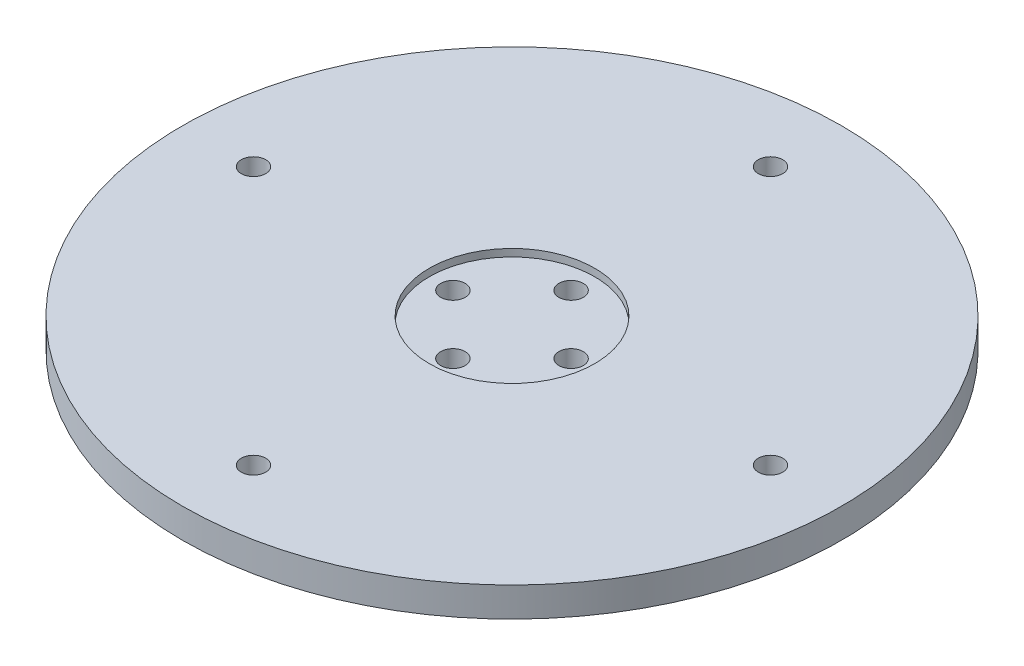
ISO-10303-21;
HEADER;
FILE_DESCRIPTION(('STEP AP214'),'2;1');
FILE_NAME('part.step','',(''),(''),'','','');
FILE_SCHEMA(('AUTOMOTIVE_DESIGN { 1 0 10303 214 1 1 1 1 }'));
ENDSEC;
DATA;
#1=APPLICATION_CONTEXT('core data for automotive mechanical design processes');
#2=APPLICATION_PROTOCOL_DEFINITION('international standard','automotive_design',2000,#1);
#3=PRODUCT_CONTEXT('',#1,'mechanical');
#4=PRODUCT('Part','Part','',(#3));
#5=PRODUCT_RELATED_PRODUCT_CATEGORY('part','',(#4));
#6=PRODUCT_DEFINITION_FORMATION('','',#4);
#7=PRODUCT_DEFINITION_CONTEXT('part definition',#1,'design');
#8=PRODUCT_DEFINITION('design','',#6,#7);
#9=PRODUCT_DEFINITION_SHAPE('','',#8);
#10=(LENGTH_UNIT() NAMED_UNIT(*) SI_UNIT(.MILLI.,.METRE.));
#11=(NAMED_UNIT(*) PLANE_ANGLE_UNIT() SI_UNIT($,.RADIAN.));
#12=(NAMED_UNIT(*) SI_UNIT($,.STERADIAN.) SOLID_ANGLE_UNIT());
#13=UNCERTAINTY_MEASURE_WITH_UNIT(LENGTH_MEASURE(1.E-05),#10,'distance_accuracy_value','');
#14=(GEOMETRIC_REPRESENTATION_CONTEXT(3) GLOBAL_UNCERTAINTY_ASSIGNED_CONTEXT((#13)) GLOBAL_UNIT_ASSIGNED_CONTEXT((#10,
#11,#12)) REPRESENTATION_CONTEXT('',''));
#15=CARTESIAN_POINT('',(0.,0.,0.));
#16=DIRECTION('',(0.,0.,1.));
#17=DIRECTION('',(1.,0.,0.));
#18=AXIS2_PLACEMENT_3D('',#15,#16,#17);
#19=CARTESIAN_POINT('',(0.,4.,-8.));
#20=DIRECTION('',(0.,-1.,0.));
#21=DIRECTION('',(0.,0.,-1.));
#22=AXIS2_PLACEMENT_3D('',#19,#20,#21);
#23=CYLINDRICAL_SURFACE('',#22,1.65);
#24=CARTESIAN_POINT('',(0.,0.,-8.));
#25=DIRECTION('',(0.,1.,0.));
#26=DIRECTION('',(0.,0.,1.));
#27=AXIS2_PLACEMENT_3D('',#24,#25,#26);
#28=CIRCLE('',#27,1.65);
#29=CARTESIAN_POINT('',(0.,0.,-6.35));
#30=VERTEX_POINT('',#29);
#31=EDGE_CURVE('E50',#30,#30,#28,.T.);
#32=ORIENTED_EDGE('',*,*,#31,.F.);
#33=EDGE_LOOP('',(#32));
#34=FACE_BOUND('',#33,.T.);
#35=CARTESIAN_POINT('',(0.,3.,-8.));
#36=DIRECTION('',(0.,1.,0.));
#37=DIRECTION('',(0.,0.,1.));
#38=AXIS2_PLACEMENT_3D('',#35,#36,#37);
#39=CIRCLE('',#38,1.65);
#40=CARTESIAN_POINT('',(0.,3.,-6.35));
#41=VERTEX_POINT('',#40);
#42=EDGE_CURVE('E85',#41,#41,#39,.T.);
#43=ORIENTED_EDGE('',*,*,#42,.T.);
#44=EDGE_LOOP('',(#43));
#45=FACE_BOUND('',#44,.T.);
#46=ADVANCED_FACE('F37',(#34,#45),#23,.F.);
#47=CARTESIAN_POINT('',(8.,4.,0.));
#48=DIRECTION('',(0.,-1.,0.));
#49=DIRECTION('',(0.,0.,-1.));
#50=AXIS2_PLACEMENT_3D('',#47,#48,#49);
#51=CYLINDRICAL_SURFACE('',#50,1.65);
#52=CARTESIAN_POINT('',(8.,0.,0.));
#53=DIRECTION('',(0.,1.,0.));
#54=DIRECTION('',(0.,0.,1.));
#55=AXIS2_PLACEMENT_3D('',#52,#53,#54);
#56=CIRCLE('',#55,1.65);
#57=CARTESIAN_POINT('',(8.,0.,1.65000000000003));
#58=VERTEX_POINT('',#57);
#59=EDGE_CURVE('E58',#58,#58,#56,.T.);
#60=ORIENTED_EDGE('',*,*,#59,.F.);
#61=EDGE_LOOP('',(#60));
#62=FACE_BOUND('',#61,.T.);
#63=CARTESIAN_POINT('',(8.,3.,0.));
#64=DIRECTION('',(0.,1.,0.));
#65=DIRECTION('',(0.,0.,1.));
#66=AXIS2_PLACEMENT_3D('',#63,#64,#65);
#67=CIRCLE('',#66,1.65);
#68=CARTESIAN_POINT('',(8.,3.,1.65000000000003));
#69=VERTEX_POINT('',#68);
#70=EDGE_CURVE('E90',#69,#69,#67,.T.);
#71=ORIENTED_EDGE('',*,*,#70,.T.);
#72=EDGE_LOOP('',(#71));
#73=FACE_BOUND('',#72,.T.);
#74=ADVANCED_FACE('F122',(#62,#73),#51,.F.);
#75=CARTESIAN_POINT('',(0.,4.,8.));
#76=DIRECTION('',(0.,-1.,0.));
#77=DIRECTION('',(0.,0.,-1.));
#78=AXIS2_PLACEMENT_3D('',#75,#76,#77);
#79=CYLINDRICAL_SURFACE('',#78,1.65);
#80=CARTESIAN_POINT('',(0.,0.,8.));
#81=DIRECTION('',(0.,1.,0.));
#82=DIRECTION('',(0.,0.,1.));
#83=AXIS2_PLACEMENT_3D('',#80,#81,#82);
#84=CIRCLE('',#83,1.65);
#85=CARTESIAN_POINT('',(0.,0.,9.65));
#86=VERTEX_POINT('',#85);
#87=EDGE_CURVE('E63',#86,#86,#84,.T.);
#88=ORIENTED_EDGE('',*,*,#87,.F.);
#89=EDGE_LOOP('',(#88));
#90=FACE_BOUND('',#89,.T.);
#91=CARTESIAN_POINT('',(0.,3.,8.));
#92=DIRECTION('',(0.,1.,0.));
#93=DIRECTION('',(0.,0.,1.));
#94=AXIS2_PLACEMENT_3D('',#91,#92,#93);
#95=CIRCLE('',#94,1.65);
#96=CARTESIAN_POINT('',(0.,3.,9.65));
#97=VERTEX_POINT('',#96);
#98=EDGE_CURVE('E93',#97,#97,#95,.T.);
#99=ORIENTED_EDGE('',*,*,#98,.T.);
#100=EDGE_LOOP('',(#99));
#101=FACE_BOUND('',#100,.T.);
#102=ADVANCED_FACE('F129',(#90,#101),#79,.F.);
#103=CARTESIAN_POINT('',(-8.,4.,0.));
#104=DIRECTION('',(0.,-1.,0.));
#105=DIRECTION('',(0.,0.,-1.));
#106=AXIS2_PLACEMENT_3D('',#103,#104,#105);
#107=CYLINDRICAL_SURFACE('',#106,1.65);
#108=CARTESIAN_POINT('',(-8.,0.,0.));
#109=DIRECTION('',(0.,1.,0.));
#110=DIRECTION('',(0.,0.,1.));
#111=AXIS2_PLACEMENT_3D('',#108,#109,#110);
#112=CIRCLE('',#111,1.65);
#113=CARTESIAN_POINT('',(-8.,0.,1.64999999999992));
#114=VERTEX_POINT('',#113);
#115=EDGE_CURVE('E66',#114,#114,#112,.T.);
#116=ORIENTED_EDGE('',*,*,#115,.F.);
#117=EDGE_LOOP('',(#116));
#118=FACE_BOUND('',#117,.T.);
#119=CARTESIAN_POINT('',(-8.,3.,0.));
#120=DIRECTION('',(0.,1.,0.));
#121=DIRECTION('',(0.,0.,1.));
#122=AXIS2_PLACEMENT_3D('',#119,#120,#121);
#123=CIRCLE('',#122,1.65);
#124=CARTESIAN_POINT('',(-8.,3.,1.64999999999992));
#125=VERTEX_POINT('',#124);
#126=EDGE_CURVE('E41',#125,#125,#123,.T.);
#127=ORIENTED_EDGE('',*,*,#126,.T.);
#128=EDGE_LOOP('',(#127));
#129=FACE_BOUND('',#128,.T.);
#130=ADVANCED_FACE('F106',(#118,#129),#107,.F.);
#131=CARTESIAN_POINT('',(0.,4.,0.));
#132=DIRECTION('',(0.,1.,0.));
#133=DIRECTION('',(0.,0.,1.));
#134=AXIS2_PLACEMENT_3D('',#131,#132,#133);
#135=PLANE('',#134);
#136=CARTESIAN_POINT('',(0.,4.,0.));
#137=DIRECTION('',(0.,1.,0.));
#138=DIRECTION('',(0.,0.,1.));
#139=AXIS2_PLACEMENT_3D('',#136,#137,#138);
#140=CIRCLE('',#139,11.2);
#141=CARTESIAN_POINT('',(0.,4.,11.2));
#142=VERTEX_POINT('',#141);
#143=EDGE_CURVE('E96',#142,#142,#140,.T.);
#144=ORIENTED_EDGE('',*,*,#143,.F.);
#145=EDGE_LOOP('',(#144));
#146=FACE_BOUND('',#145,.T.);
#147=CARTESIAN_POINT('',(-2.44403693719019E-13,4.,35.));
#148=DIRECTION('',(0.,1.,0.));
#149=DIRECTION('',(0.,0.,1.));
#150=AXIS2_PLACEMENT_3D('',#147,#148,#149);
#151=CIRCLE('',#150,1.65);
#152=CARTESIAN_POINT('',(-2.44403693719019E-13,4.,36.65));
#153=VERTEX_POINT('',#152);
#154=EDGE_CURVE('E73',#153,#153,#151,.T.);
#155=ORIENTED_EDGE('',*,*,#154,.F.);
#156=EDGE_LOOP('',(#155));
#157=FACE_BOUND('',#156,.T.);
#158=CARTESIAN_POINT('',(0.,4.,0.));
#159=DIRECTION('',(0.,1.,0.));
#160=DIRECTION('',(0.,0.,1.));
#161=AXIS2_PLACEMENT_3D('',#158,#159,#160);
#162=CIRCLE('',#161,44.617697352684);
#163=CARTESIAN_POINT('',(0.,4.,44.617697352684));
#164=VERTEX_POINT('',#163);
#165=EDGE_CURVE('E10',#164,#164,#162,.T.);
#166=ORIENTED_EDGE('',*,*,#165,.T.);
#167=EDGE_LOOP('',(#166));
#168=FACE_BOUND('',#167,.T.);
#169=CARTESIAN_POINT('',(0.,4.,-35.));
#170=DIRECTION('',(0.,1.,0.));
#171=DIRECTION('',(0.,0.,1.));
#172=AXIS2_PLACEMENT_3D('',#169,#170,#171);
#173=CIRCLE('',#172,1.65);
#174=CARTESIAN_POINT('',(0.,4.,-33.35));
#175=VERTEX_POINT('',#174);
#176=EDGE_CURVE('E54',#175,#175,#173,.T.);
#177=ORIENTED_EDGE('',*,*,#176,.F.);
#178=EDGE_LOOP('',(#177));
#179=FACE_BOUND('',#178,.T.);
#180=CARTESIAN_POINT('',(35.,4.,1.2220184685951E-13));
#181=DIRECTION('',(0.,1.,0.));
#182=DIRECTION('',(0.,0.,1.));
#183=AXIS2_PLACEMENT_3D('',#180,#181,#182);
#184=CIRCLE('',#183,1.65);
#185=CARTESIAN_POINT('',(35.,4.,1.65000000000012));
#186=VERTEX_POINT('',#185);
#187=EDGE_CURVE('E69',#186,#186,#184,.T.);
#188=ORIENTED_EDGE('',*,*,#187,.F.);
#189=EDGE_LOOP('',(#188));
#190=FACE_BOUND('',#189,.T.);
#191=CARTESIAN_POINT('',(-35.,4.,-3.66605540578529E-13));
#192=DIRECTION('',(0.,1.,0.));
#193=DIRECTION('',(0.,0.,1.));
#194=AXIS2_PLACEMENT_3D('',#191,#192,#193);
#195=CIRCLE('',#194,1.65);
#196=CARTESIAN_POINT('',(-35.,4.,1.64999999999963));
#197=VERTEX_POINT('',#196);
#198=EDGE_CURVE('E79',#197,#197,#195,.T.);
#199=ORIENTED_EDGE('',*,*,#198,.F.);
#200=EDGE_LOOP('',(#199));
#201=FACE_BOUND('',#200,.T.);
#202=ADVANCED_FACE('F137',(#146,#157,#168,#179,#190,#201),#135,.T.);
#203=CARTESIAN_POINT('',(0.,0.,0.));
#204=DIRECTION('',(0.,1.,0.));
#205=DIRECTION('',(0.,0.,1.));
#206=AXIS2_PLACEMENT_3D('',#203,#204,#205);
#207=PLANE('',#206);
#208=CARTESIAN_POINT('',(0.,0.,0.));
#209=DIRECTION('',(0.,1.,0.));
#210=DIRECTION('',(0.,0.,1.));
#211=AXIS2_PLACEMENT_3D('',#208,#209,#210);
#212=CIRCLE('',#211,44.617697352684);
#213=CARTESIAN_POINT('',(0.,0.,44.617697352684));
#214=VERTEX_POINT('',#213);
#215=EDGE_CURVE('E45',#214,#214,#212,.T.);
#216=ORIENTED_EDGE('',*,*,#215,.F.);
#217=EDGE_LOOP('',(#216));
#218=FACE_BOUND('',#217,.T.);
#219=ORIENTED_EDGE('',*,*,#31,.T.);
#220=EDGE_LOOP('',(#219));
#221=FACE_BOUND('',#220,.T.);
#222=CARTESIAN_POINT('',(0.,0.,-35.));
#223=DIRECTION('',(0.,1.,0.));
#224=DIRECTION('',(0.,0.,1.));
#225=AXIS2_PLACEMENT_3D('',#222,#223,#224);
#226=CIRCLE('',#225,1.65);
#227=CARTESIAN_POINT('',(0.,0.,-33.35));
#228=VERTEX_POINT('',#227);
#229=EDGE_CURVE('E55',#228,#228,#226,.T.);
#230=ORIENTED_EDGE('',*,*,#229,.T.);
#231=EDGE_LOOP('',(#230));
#232=FACE_BOUND('',#231,.T.);
#233=ORIENTED_EDGE('',*,*,#59,.T.);
#234=EDGE_LOOP('',(#233));
#235=FACE_BOUND('',#234,.T.);
#236=ORIENTED_EDGE('',*,*,#87,.T.);
#237=EDGE_LOOP('',(#236));
#238=FACE_BOUND('',#237,.T.);
#239=ORIENTED_EDGE('',*,*,#115,.T.);
#240=EDGE_LOOP('',(#239));
#241=FACE_BOUND('',#240,.T.);
#242=CARTESIAN_POINT('',(35.,0.,1.2220184685951E-13));
#243=DIRECTION('',(0.,1.,0.));
#244=DIRECTION('',(0.,0.,1.));
#245=AXIS2_PLACEMENT_3D('',#242,#243,#244);
#246=CIRCLE('',#245,1.65);
#247=CARTESIAN_POINT('',(35.,0.,1.65000000000012));
#248=VERTEX_POINT('',#247);
#249=EDGE_CURVE('E70',#248,#248,#246,.T.);
#250=ORIENTED_EDGE('',*,*,#249,.T.);
#251=EDGE_LOOP('',(#250));
#252=FACE_BOUND('',#251,.T.);
#253=CARTESIAN_POINT('',(-2.44403693719019E-13,0.,35.));
#254=DIRECTION('',(0.,1.,0.));
#255=DIRECTION('',(0.,0.,1.));
#256=AXIS2_PLACEMENT_3D('',#253,#254,#255);
#257=CIRCLE('',#256,1.65);
#258=CARTESIAN_POINT('',(-2.44403693719019E-13,0.,36.65));
#259=VERTEX_POINT('',#258);
#260=EDGE_CURVE('E76',#259,#259,#257,.T.);
#261=ORIENTED_EDGE('',*,*,#260,.T.);
#262=EDGE_LOOP('',(#261));
#263=FACE_BOUND('',#262,.T.);
#264=CARTESIAN_POINT('',(-35.,0.,-3.66605540578529E-13));
#265=DIRECTION('',(0.,1.,0.));
#266=DIRECTION('',(0.,0.,1.));
#267=AXIS2_PLACEMENT_3D('',#264,#265,#266);
#268=CIRCLE('',#267,1.65);
#269=CARTESIAN_POINT('',(-35.,0.,1.64999999999963));
#270=VERTEX_POINT('',#269);
#271=EDGE_CURVE('E82',#270,#270,#268,.T.);
#272=ORIENTED_EDGE('',*,*,#271,.T.);
#273=EDGE_LOOP('',(#272));
#274=FACE_BOUND('',#273,.T.);
#275=ADVANCED_FACE('F139',(#218,#221,#232,#235,#238,#241,#252,#263,#274),#207,.F.);
#276=CARTESIAN_POINT('',(0.,4.,0.));
#277=DIRECTION('',(0.,-1.,0.));
#278=DIRECTION('',(0.,0.,-1.));
#279=AXIS2_PLACEMENT_3D('',#276,#277,#278);
#280=CYLINDRICAL_SURFACE('',#279,44.617697352684);
#281=ORIENTED_EDGE('',*,*,#165,.F.);
#282=EDGE_LOOP('',(#281));
#283=FACE_BOUND('',#282,.T.);
#284=ORIENTED_EDGE('',*,*,#215,.T.);
#285=EDGE_LOOP('',(#284));
#286=FACE_BOUND('',#285,.T.);
#287=ADVANCED_FACE('F39',(#283,#286),#280,.T.);
#288=CARTESIAN_POINT('',(0.,4.,-35.));
#289=DIRECTION('',(0.,-1.,0.));
#290=DIRECTION('',(0.,0.,-1.));
#291=AXIS2_PLACEMENT_3D('',#288,#289,#290);
#292=CYLINDRICAL_SURFACE('',#291,1.65);
#293=ORIENTED_EDGE('',*,*,#176,.T.);
#294=EDGE_LOOP('',(#293));
#295=FACE_BOUND('',#294,.T.);
#296=ORIENTED_EDGE('',*,*,#229,.F.);
#297=EDGE_LOOP('',(#296));
#298=FACE_BOUND('',#297,.T.);
#299=ADVANCED_FACE('F136',(#295,#298),#292,.F.);
#300=CARTESIAN_POINT('',(35.,4.,1.2220184685951E-13));
#301=DIRECTION('',(0.,-1.,0.));
#302=DIRECTION('',(0.,0.,-1.));
#303=AXIS2_PLACEMENT_3D('',#300,#301,#302);
#304=CYLINDRICAL_SURFACE('',#303,1.65);
#305=ORIENTED_EDGE('',*,*,#187,.T.);
#306=EDGE_LOOP('',(#305));
#307=FACE_BOUND('',#306,.T.);
#308=ORIENTED_EDGE('',*,*,#249,.F.);
#309=EDGE_LOOP('',(#308));
#310=FACE_BOUND('',#309,.T.);
#311=ADVANCED_FACE('F170',(#307,#310),#304,.F.);
#312=CARTESIAN_POINT('',(-2.44403693719019E-13,4.,35.));
#313=DIRECTION('',(0.,-1.,0.));
#314=DIRECTION('',(0.,0.,-1.));
#315=AXIS2_PLACEMENT_3D('',#312,#313,#314);
#316=CYLINDRICAL_SURFACE('',#315,1.65);
#317=ORIENTED_EDGE('',*,*,#154,.T.);
#318=EDGE_LOOP('',(#317));
#319=FACE_BOUND('',#318,.T.);
#320=ORIENTED_EDGE('',*,*,#260,.F.);
#321=EDGE_LOOP('',(#320));
#322=FACE_BOUND('',#321,.T.);
#323=ADVANCED_FACE('F164',(#319,#322),#316,.F.);
#324=CARTESIAN_POINT('',(-35.,4.,-3.66605540578529E-13));
#325=DIRECTION('',(0.,-1.,0.));
#326=DIRECTION('',(0.,0.,-1.));
#327=AXIS2_PLACEMENT_3D('',#324,#325,#326);
#328=CYLINDRICAL_SURFACE('',#327,1.65);
#329=ORIENTED_EDGE('',*,*,#198,.T.);
#330=EDGE_LOOP('',(#329));
#331=FACE_BOUND('',#330,.T.);
#332=ORIENTED_EDGE('',*,*,#271,.F.);
#333=EDGE_LOOP('',(#332));
#334=FACE_BOUND('',#333,.T.);
#335=ADVANCED_FACE('F116',(#331,#334),#328,.F.);
#336=CARTESIAN_POINT('',(0.,3.,0.));
#337=DIRECTION('',(0.,1.,0.));
#338=DIRECTION('',(0.,0.,1.));
#339=AXIS2_PLACEMENT_3D('',#336,#337,#338);
#340=CYLINDRICAL_SURFACE('',#339,11.2);
#341=CARTESIAN_POINT('',(0.,3.,0.));
#342=DIRECTION('',(0.,1.,0.));
#343=DIRECTION('',(0.,0.,1.));
#344=AXIS2_PLACEMENT_3D('',#341,#342,#343);
#345=CIRCLE('',#344,11.2);
#346=CARTESIAN_POINT('',(0.,3.,11.2));
#347=VERTEX_POINT('',#346);
#348=EDGE_CURVE('E99',#347,#347,#345,.T.);
#349=ORIENTED_EDGE('',*,*,#348,.F.);
#350=EDGE_LOOP('',(#349));
#351=FACE_BOUND('',#350,.T.);
#352=ORIENTED_EDGE('',*,*,#143,.T.);
#353=EDGE_LOOP('',(#352));
#354=FACE_BOUND('',#353,.T.);
#355=ADVANCED_FACE('F110',(#351,#354),#340,.F.);
#356=CARTESIAN_POINT('',(0.,3.,0.));
#357=DIRECTION('',(0.,1.,0.));
#358=DIRECTION('',(0.,0.,1.));
#359=AXIS2_PLACEMENT_3D('',#356,#357,#358);
#360=PLANE('',#359);
#361=ORIENTED_EDGE('',*,*,#42,.F.);
#362=EDGE_LOOP('',(#361));
#363=FACE_BOUND('',#362,.T.);
#364=ORIENTED_EDGE('',*,*,#70,.F.);
#365=EDGE_LOOP('',(#364));
#366=FACE_BOUND('',#365,.T.);
#367=ORIENTED_EDGE('',*,*,#98,.F.);
#368=EDGE_LOOP('',(#367));
#369=FACE_BOUND('',#368,.T.);
#370=ORIENTED_EDGE('',*,*,#126,.F.);
#371=EDGE_LOOP('',(#370));
#372=FACE_BOUND('',#371,.T.);
#373=ORIENTED_EDGE('',*,*,#348,.T.);
#374=EDGE_LOOP('',(#373));
#375=FACE_BOUND('',#374,.T.);
#376=ADVANCED_FACE('F108',(#363,#366,#369,#372,#375),#360,.T.);
#377=CLOSED_SHELL('',(#46,#74,#102,#130,#202,#275,#287,#299,#311,#323,#335,#355,#376));
#378=MANIFOLD_SOLID_BREP('B2',#377);
#379=ADVANCED_BREP_SHAPE_REPRESENTATION('',(#18,#378),#14);
#380=SHAPE_DEFINITION_REPRESENTATION(#9,#379);
ENDSEC;
END-ISO-10303-21;
